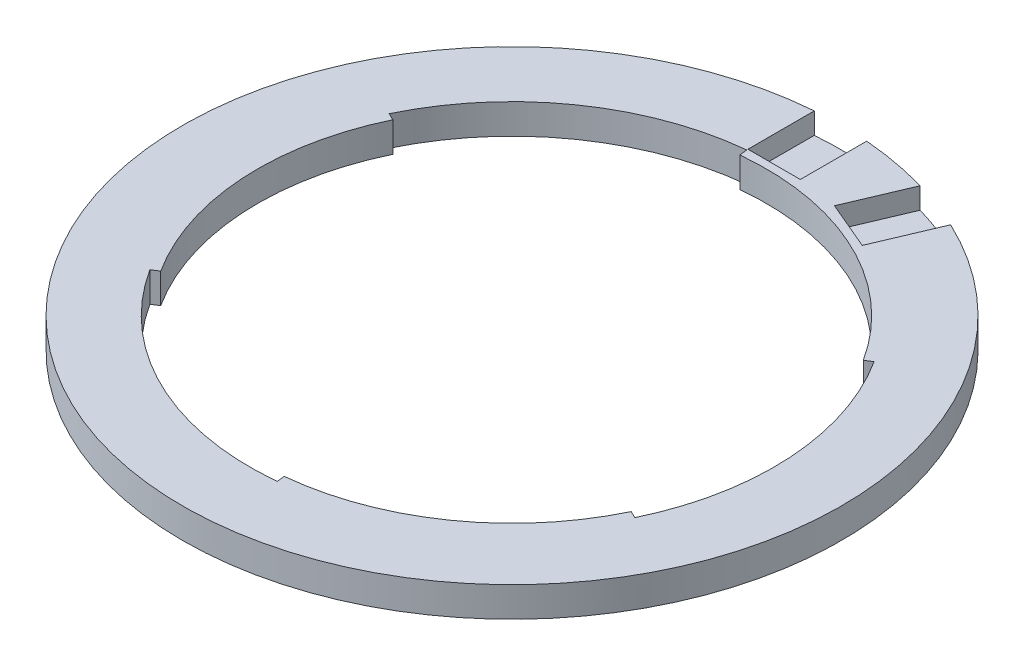
ISO-10303-21;
HEADER;
FILE_DESCRIPTION(('STEP AP214'),'2;1');
FILE_NAME('part.step','',(''),(''),'','','');
FILE_SCHEMA(('AUTOMOTIVE_DESIGN { 1 0 10303 214 1 1 1 1 }'));
ENDSEC;
DATA;
#1=APPLICATION_CONTEXT('core data for automotive mechanical design processes');
#2=APPLICATION_PROTOCOL_DEFINITION('international standard','automotive_design',2000,#1);
#3=PRODUCT_CONTEXT('',#1,'mechanical');
#4=PRODUCT('Part','Part','',(#3));
#5=PRODUCT_RELATED_PRODUCT_CATEGORY('part','',(#4));
#6=PRODUCT_DEFINITION_FORMATION('','',#4);
#7=PRODUCT_DEFINITION_CONTEXT('part definition',#1,'design');
#8=PRODUCT_DEFINITION('design','',#6,#7);
#9=PRODUCT_DEFINITION_SHAPE('','',#8);
#10=(LENGTH_UNIT() NAMED_UNIT(*) SI_UNIT(.MILLI.,.METRE.));
#11=(NAMED_UNIT(*) PLANE_ANGLE_UNIT() SI_UNIT($,.RADIAN.));
#12=(NAMED_UNIT(*) SI_UNIT($,.STERADIAN.) SOLID_ANGLE_UNIT());
#13=UNCERTAINTY_MEASURE_WITH_UNIT(LENGTH_MEASURE(1.E-05),#10,'distance_accuracy_value','');
#14=(GEOMETRIC_REPRESENTATION_CONTEXT(3) GLOBAL_UNCERTAINTY_ASSIGNED_CONTEXT((#13)) GLOBAL_UNIT_ASSIGNED_CONTEXT((#10,
#11,#12)) REPRESENTATION_CONTEXT('',''));
#15=CARTESIAN_POINT('',(0.,0.,0.));
#16=DIRECTION('',(0.,0.,1.));
#17=DIRECTION('',(1.,0.,0.));
#18=AXIS2_PLACEMENT_3D('',#15,#16,#17);
#19=CARTESIAN_POINT('',(0.,2.4,0.));
#20=DIRECTION('',(0.,1.,0.));
#21=DIRECTION('',(0.,0.,1.));
#22=AXIS2_PLACEMENT_3D('',#19,#20,#21);
#23=PLANE('',#22);
#24=CARTESIAN_POINT('',(0.,2.4,0.));
#25=DIRECTION('',(0.,1.,0.));
#26=DIRECTION('',(0.,0.,1.));
#27=AXIS2_PLACEMENT_3D('',#24,#25,#26);
#28=CIRCLE('',#27,20.376145218496);
#29=CARTESIAN_POINT('',(2.02750222855229,2.4,20.2750222855229));
#30=VERTEX_POINT('',#29);
#31=CARTESIAN_POINT('',(18.3683117845196,2.4,8.82000091564142));
#32=VERTEX_POINT('',#31);
#33=EDGE_CURVE('E223',#30,#32,#28,.T.);
#34=ORIENTED_EDGE('',*,*,#33,.F.);
#35=DIRECTION('',(0.0995037190209989,0.,0.995037190209989));
#36=VECTOR('',#35,1.);
#37=CARTESIAN_POINT('',(0.,2.4,0.));
#38=LINE('',#37,#36);
#39=CARTESIAN_POINT('',(2.09011250968342,2.4,20.9011250968342));
#40=VERTEX_POINT('',#39);
#41=EDGE_CURVE('E235',#30,#40,#38,.T.);
#42=ORIENTED_EDGE('',*,*,#41,.T.);
#43=CARTESIAN_POINT('',(0.,2.4,0.));
#44=DIRECTION('',(0.,1.,0.));
#45=DIRECTION('',(0.,0.,1.));
#46=AXIS2_PLACEMENT_3D('',#43,#44,#45);
#47=CIRCLE('',#46,21.0053707564673);
#48=CARTESIAN_POINT('',(-17.6960082683758,2.4,11.317106166429));
#49=VERTEX_POINT('',#48);
#50=EDGE_CURVE('E247',#49,#40,#47,.T.);
#51=ORIENTED_EDGE('',*,*,#50,.F.);
#52=DIRECTION('',(0.842451603141898,0.,-0.538772026337343));
#53=VECTOR('',#52,1.);
#54=CARTESIAN_POINT('',(0.,2.4,0.));
#55=LINE('',#54,#53);
#56=CARTESIAN_POINT('',(-17.165916205174,2.4,10.978097048313));
#57=VERTEX_POINT('',#56);
#58=EDGE_CURVE('E252',#49,#57,#55,.T.);
#59=ORIENTED_EDGE('',*,*,#58,.T.);
#60=CARTESIAN_POINT('',(-18.3683117845196,2.4,-8.82000091564142));
#61=VERTEX_POINT('',#60);
#62=EDGE_CURVE('E241',#61,#57,#28,.T.);
#63=ORIENTED_EDGE('',*,*,#62,.F.);
#64=DIRECTION('',(0.901461566334253,0.,0.432859150789486));
#65=VECTOR('',#64,1.);
#66=CARTESIAN_POINT('',(0.,2.4,0.));
#67=LINE('',#66,#65);
#68=CARTESIAN_POINT('',(-18.9355344235567,2.4,-9.09236694766272));
#69=VERTEX_POINT('',#68);
#70=EDGE_CURVE('E263',#69,#61,#67,.T.);
#71=ORIENTED_EDGE('',*,*,#70,.F.);
#72=CARTESIAN_POINT('',(0.,2.4,0.));
#73=DIRECTION('',(0.,1.,0.));
#74=DIRECTION('',(0.,0.,1.));
#75=AXIS2_PLACEMENT_3D('',#72,#73,#74);
#76=CIRCLE('',#75,21.0053707564673);
#77=CARTESIAN_POINT('',(-2.09011250968342,2.4,-20.9011250968342));
#78=VERTEX_POINT('',#77);
#79=EDGE_CURVE('E272',#78,#69,#76,.T.);
#80=ORIENTED_EDGE('',*,*,#79,.F.);
#81=DIRECTION('',(-0.0995037190209989,0.,-0.995037190209989));
#82=VECTOR('',#81,1.);
#83=CARTESIAN_POINT('',(0.,2.4,0.));
#84=LINE('',#83,#82);
#85=CARTESIAN_POINT('',(-2.02750222855229,2.4,-20.2750222855229));
#86=VERTEX_POINT('',#85);
#87=EDGE_CURVE('E270',#86,#78,#84,.T.);
#88=ORIENTED_EDGE('',*,*,#87,.F.);
#89=CARTESIAN_POINT('',(17.165916205174,2.4,-10.978097048313));
#90=VERTEX_POINT('',#89);
#91=EDGE_CURVE('E239',#90,#86,#28,.T.);
#92=ORIENTED_EDGE('',*,*,#91,.F.);
#93=DIRECTION('',(0.842451603141898,0.,-0.538772026337343));
#94=VECTOR('',#93,1.);
#95=CARTESIAN_POINT('',(0.,2.4,0.));
#96=LINE('',#95,#94);
#97=CARTESIAN_POINT('',(17.6960082683758,2.4,-11.317106166429));
#98=VERTEX_POINT('',#97);
#99=EDGE_CURVE('E285',#90,#98,#96,.T.);
#100=ORIENTED_EDGE('',*,*,#99,.T.);
#101=CARTESIAN_POINT('',(0.,2.4,0.));
#102=DIRECTION('',(0.,1.,0.));
#103=DIRECTION('',(0.,0.,1.));
#104=AXIS2_PLACEMENT_3D('',#101,#102,#103);
#105=CIRCLE('',#104,21.0053707564673);
#106=CARTESIAN_POINT('',(18.9355344235567,2.4,9.09236694766273));
#107=VERTEX_POINT('',#106);
#108=EDGE_CURVE('E292',#107,#98,#105,.T.);
#109=ORIENTED_EDGE('',*,*,#108,.F.);
#110=DIRECTION('',(0.901461566334253,0.,0.432859150789486));
#111=VECTOR('',#110,1.);
#112=CARTESIAN_POINT('',(0.,2.4,0.));
#113=LINE('',#112,#111);
#114=EDGE_CURVE('E238',#32,#107,#113,.T.);
#115=ORIENTED_EDGE('',*,*,#114,.F.);
#116=EDGE_LOOP('',(#34,#42,#51,#59,#63,#71,#80,#88,#92,#100,#109,#115));
#117=FACE_BOUND('',#116,.T.);
#118=DIRECTION('',(-0.390400317849414,0.,0.920645204094974));
#119=VECTOR('',#118,1.);
#120=CARTESIAN_POINT('',(-2.90003239289916,2.4,-1.22976100122565));
#121=LINE('',#120,#119);
#122=CARTESIAN_POINT('',(7.33290657314833,2.4,-25.3611608801624));
#123=VERTEX_POINT('',#122);
#124=CARTESIAN_POINT('',(5.29021923078603,2.4,-20.5440789792794));
#125=VERTEX_POINT('',#124);
#126=EDGE_CURVE('E327',#123,#125,#121,.T.);
#127=ORIENTED_EDGE('',*,*,#126,.F.);
#128=CARTESIAN_POINT('',(0.,2.4,0.));
#129=DIRECTION('',(0.,1.,0.));
#130=DIRECTION('',(0.,0.,1.));
#131=AXIS2_PLACEMENT_3D('',#128,#129,#130);
#132=CIRCLE('',#131,26.4);
#133=CARTESIAN_POINT('',(2.1,2.4,-26.3163447309842));
#134=VERTEX_POINT('',#133);
#135=EDGE_CURVE('E306',#123,#134,#132,.T.);
#136=ORIENTED_EDGE('',*,*,#135,.T.);
#137=DIRECTION('',(0.,0.,1.));
#138=VECTOR('',#137,1.);
#139=CARTESIAN_POINT('',(2.10000000000002,2.4,0.));
#140=LINE('',#139,#138);
#141=CARTESIAN_POINT('',(2.1,2.4,-21.));
#142=VERTEX_POINT('',#141);
#143=EDGE_CURVE('E345',#134,#142,#140,.T.);
#144=ORIENTED_EDGE('',*,*,#143,.T.);
#145=DIRECTION('',(-1.,0.,0.));
#146=VECTOR('',#145,1.);
#147=CARTESIAN_POINT('',(0.,2.4,-21.));
#148=LINE('',#147,#146);
#149=CARTESIAN_POINT('',(-2.1,2.4,-21.));
#150=VERTEX_POINT('',#149);
#151=EDGE_CURVE('E343',#142,#150,#148,.T.);
#152=ORIENTED_EDGE('',*,*,#151,.T.);
#153=DIRECTION('',(0.,0.,-1.));
#154=VECTOR('',#153,1.);
#155=CARTESIAN_POINT('',(-2.10000000000002,2.4,0.));
#156=LINE('',#155,#154);
#157=CARTESIAN_POINT('',(-2.1,2.4,-26.3163447309842));
#158=VERTEX_POINT('',#157);
#159=EDGE_CURVE('E337',#150,#158,#156,.T.);
#160=ORIENTED_EDGE('',*,*,#159,.T.);
#161=CARTESIAN_POINT('',(11.2650908043718,2.4,-23.8758817464248));
#162=VERTEX_POINT('',#161);
#163=EDGE_CURVE('E334',#158,#162,#132,.T.);
#164=ORIENTED_EDGE('',*,*,#163,.T.);
#165=DIRECTION('',(0.390400317849414,0.,-0.920645204094974));
#166=VECTOR('',#165,1.);
#167=CARTESIAN_POINT('',(11.2650908043718,2.4,-23.8758817464248));
#168=LINE('',#167,#166);
#169=CARTESIAN_POINT('',(9.15692908798492,2.4,-18.9043976443119));
#170=VERTEX_POINT('',#169);
#171=EDGE_CURVE('E323',#170,#162,#168,.T.);
#172=ORIENTED_EDGE('',*,*,#171,.F.);
#173=DIRECTION('',(0.920645204094974,0.,0.390400317849414));
#174=VECTOR('',#173,1.);
#175=CARTESIAN_POINT('',(9.15692908798492,2.4,-18.9043976443119));
#176=LINE('',#175,#174);
#177=EDGE_CURVE('E320',#125,#170,#176,.T.);
#178=ORIENTED_EDGE('',*,*,#177,.F.);
#179=EDGE_LOOP('',(#127,#136,#144,#152,#160,#164,#172,#178));
#180=FACE_BOUND('',#179,.T.);
#181=ADVANCED_FACE('F82',(#117,#180),#23,.T.);
#182=CARTESIAN_POINT('',(0.,0.,0.));
#183=DIRECTION('',(0.,1.,0.));
#184=DIRECTION('',(0.,0.,1.));
#185=AXIS2_PLACEMENT_3D('',#182,#183,#184);
#186=PLANE('',#185);
#187=CARTESIAN_POINT('',(0.,0.,0.));
#188=DIRECTION('',(0.,1.,0.));
#189=DIRECTION('',(0.,0.,1.));
#190=AXIS2_PLACEMENT_3D('',#187,#188,#189);
#191=CIRCLE('',#190,26.4);
#192=CARTESIAN_POINT('',(0.,0.,26.4));
#193=VERTEX_POINT('',#192);
#194=EDGE_CURVE('E299',#193,#193,#191,.T.);
#195=ORIENTED_EDGE('',*,*,#194,.F.);
#196=EDGE_LOOP('',(#195));
#197=FACE_BOUND('',#196,.T.);
#198=DIRECTION('',(0.0995037190209989,0.,0.995037190209989));
#199=VECTOR('',#198,1.);
#200=CARTESIAN_POINT('',(0.,0.,0.));
#201=LINE('',#200,#199);
#202=CARTESIAN_POINT('',(2.02750222855229,0.,20.2750222855229));
#203=VERTEX_POINT('',#202);
#204=CARTESIAN_POINT('',(2.09011250968342,0.,20.9011250968342));
#205=VERTEX_POINT('',#204);
#206=EDGE_CURVE('E259',#203,#205,#201,.T.);
#207=ORIENTED_EDGE('',*,*,#206,.F.);
#208=CARTESIAN_POINT('',(0.,0.,0.));
#209=DIRECTION('',(0.,1.,0.));
#210=DIRECTION('',(0.,0.,1.));
#211=AXIS2_PLACEMENT_3D('',#208,#209,#210);
#212=CIRCLE('',#211,20.376145218496);
#213=CARTESIAN_POINT('',(18.3683117845196,0.,8.82000091564142));
#214=VERTEX_POINT('',#213);
#215=EDGE_CURVE('E98',#203,#214,#212,.T.);
#216=ORIENTED_EDGE('',*,*,#215,.T.);
#217=DIRECTION('',(0.901461566334253,0.,0.432859150789486));
#218=VECTOR('',#217,1.);
#219=CARTESIAN_POINT('',(0.,0.,0.));
#220=LINE('',#219,#218);
#221=CARTESIAN_POINT('',(18.9355344235567,0.,9.09236694766273));
#222=VERTEX_POINT('',#221);
#223=EDGE_CURVE('E282',#214,#222,#220,.T.);
#224=ORIENTED_EDGE('',*,*,#223,.T.);
#225=CARTESIAN_POINT('',(0.,0.,0.));
#226=DIRECTION('',(0.,1.,0.));
#227=DIRECTION('',(0.,0.,1.));
#228=AXIS2_PLACEMENT_3D('',#225,#226,#227);
#229=CIRCLE('',#228,21.0053707564673);
#230=CARTESIAN_POINT('',(17.6960082683758,0.,-11.317106166429));
#231=VERTEX_POINT('',#230);
#232=EDGE_CURVE('E284',#222,#231,#229,.T.);
#233=ORIENTED_EDGE('',*,*,#232,.T.);
#234=DIRECTION('',(0.842451603141898,0.,-0.538772026337343));
#235=VECTOR('',#234,1.);
#236=CARTESIAN_POINT('',(0.,0.,0.));
#237=LINE('',#236,#235);
#238=CARTESIAN_POINT('',(17.165916205174,0.,-10.978097048313));
#239=VERTEX_POINT('',#238);
#240=EDGE_CURVE('E288',#239,#231,#237,.T.);
#241=ORIENTED_EDGE('',*,*,#240,.F.);
#242=CARTESIAN_POINT('',(-2.02750222855229,0.,-20.2750222855229));
#243=VERTEX_POINT('',#242);
#244=EDGE_CURVE('E500',#239,#243,#212,.T.);
#245=ORIENTED_EDGE('',*,*,#244,.T.);
#246=DIRECTION('',(-0.0995037190209989,0.,-0.995037190209989));
#247=VECTOR('',#246,1.);
#248=CARTESIAN_POINT('',(0.,0.,0.));
#249=LINE('',#248,#247);
#250=CARTESIAN_POINT('',(-2.09011250968342,0.,-20.9011250968342));
#251=VERTEX_POINT('',#250);
#252=EDGE_CURVE('E260',#243,#251,#249,.T.);
#253=ORIENTED_EDGE('',*,*,#252,.T.);
#254=CARTESIAN_POINT('',(0.,0.,0.));
#255=DIRECTION('',(0.,1.,0.));
#256=DIRECTION('',(0.,0.,1.));
#257=AXIS2_PLACEMENT_3D('',#254,#255,#256);
#258=CIRCLE('',#257,21.0053707564673);
#259=CARTESIAN_POINT('',(-18.9355344235567,0.,-9.09236694766272));
#260=VERTEX_POINT('',#259);
#261=EDGE_CURVE('E262',#251,#260,#258,.T.);
#262=ORIENTED_EDGE('',*,*,#261,.T.);
#263=DIRECTION('',(0.901461566334253,0.,0.432859150789486));
#264=VECTOR('',#263,1.);
#265=CARTESIAN_POINT('',(0.,0.,0.));
#266=LINE('',#265,#264);
#267=CARTESIAN_POINT('',(-18.3683117845196,0.,-8.82000091564142));
#268=VERTEX_POINT('',#267);
#269=EDGE_CURVE('E266',#260,#268,#266,.T.);
#270=ORIENTED_EDGE('',*,*,#269,.T.);
#271=CARTESIAN_POINT('',(-17.165916205174,0.,10.978097048313));
#272=VERTEX_POINT('',#271);
#273=EDGE_CURVE('E106',#268,#272,#212,.T.);
#274=ORIENTED_EDGE('',*,*,#273,.T.);
#275=DIRECTION('',(0.842451603141898,0.,-0.538772026337343));
#276=VECTOR('',#275,1.);
#277=CARTESIAN_POINT('',(0.,0.,0.));
#278=LINE('',#277,#276);
#279=CARTESIAN_POINT('',(-17.6960082683758,0.,11.317106166429));
#280=VERTEX_POINT('',#279);
#281=EDGE_CURVE('E246',#280,#272,#278,.T.);
#282=ORIENTED_EDGE('',*,*,#281,.F.);
#283=CARTESIAN_POINT('',(0.,0.,0.));
#284=DIRECTION('',(0.,1.,0.));
#285=DIRECTION('',(0.,0.,1.));
#286=AXIS2_PLACEMENT_3D('',#283,#284,#285);
#287=CIRCLE('',#286,21.0053707564673);
#288=EDGE_CURVE('E250',#280,#205,#287,.T.);
#289=ORIENTED_EDGE('',*,*,#288,.T.);
#290=EDGE_LOOP('',(#207,#216,#224,#233,#241,#245,#253,#262,#270,#274,#282,#289));
#291=FACE_BOUND('',#290,.T.);
#292=ADVANCED_FACE('F398',(#197,#291),#186,.F.);
#293=CARTESIAN_POINT('',(0.,2.4,0.));
#294=DIRECTION('',(0.,-1.,0.));
#295=DIRECTION('',(0.,0.,-1.));
#296=AXIS2_PLACEMENT_3D('',#293,#294,#295);
#297=CYLINDRICAL_SURFACE('',#296,26.4);
#298=ORIENTED_EDGE('',*,*,#194,.T.);
#299=EDGE_LOOP('',(#298));
#300=FACE_BOUND('',#299,.T.);
#301=CARTESIAN_POINT('',(11.2650908043718,0.7,-23.8758817464248));
#302=DIRECTION('',(-0.920645204094974,0.,-0.390400317849414));
#303=VECTOR('',#302,1.);
#304=LINE('',#301,#303);
#305=CARTESIAN_POINT('',(11.2650908043718,0.7,-23.8758817464248));
#306=VERTEX_POINT('',#305);
#307=CARTESIAN_POINT('',(9.33173587577228,0.7,-24.6957224139085));
#308=VERTEX_POINT('',#307);
#309=EDGE_CURVE('E376',#306,#308,#304,.T.);
#310=ORIENTED_EDGE('',*,*,#309,.F.);
#311=DIRECTION('',(0.,1.,0.));
#312=VECTOR('',#311,1.);
#313=CARTESIAN_POINT('',(11.2650908043718,0.7,-23.8758817464248));
#314=LINE('',#313,#312);
#315=EDGE_CURVE('E317',#306,#162,#314,.T.);
#316=ORIENTED_EDGE('',*,*,#315,.T.);
#317=ORIENTED_EDGE('',*,*,#163,.F.);
#318=DIRECTION('',(0.,-1.,0.));
#319=VECTOR('',#318,1.);
#320=CARTESIAN_POINT('',(-2.1,2.4,-26.3163447309842));
#321=LINE('',#320,#319);
#322=CARTESIAN_POINT('',(-2.1,0.7,-26.3163447309842));
#323=VERTEX_POINT('',#322);
#324=EDGE_CURVE('E360',#323,#158,#321,.F.);
#325=ORIENTED_EDGE('',*,*,#324,.F.);
#326=CARTESIAN_POINT('',(0.,0.7,0.));
#327=DIRECTION('',(0.,1.,0.));
#328=DIRECTION('',(0.,0.,1.));
#329=AXIS2_PLACEMENT_3D('',#326,#327,#328);
#330=CIRCLE('',#329,26.4);
#331=CARTESIAN_POINT('',(2.1,0.7,-26.3163447309842));
#332=VERTEX_POINT('',#331);
#333=EDGE_CURVE('E336',#332,#323,#330,.T.);
#334=ORIENTED_EDGE('',*,*,#333,.F.);
#335=DIRECTION('',(0.,-1.,0.));
#336=VECTOR('',#335,1.);
#337=CARTESIAN_POINT('',(2.1,2.4,-26.3163447309842));
#338=LINE('',#337,#336);
#339=EDGE_CURVE('E341',#134,#332,#338,.T.);
#340=ORIENTED_EDGE('',*,*,#339,.F.);
#341=ORIENTED_EDGE('',*,*,#135,.F.);
#342=DIRECTION('',(0.,-1.,0.));
#343=VECTOR('',#342,1.);
#344=CARTESIAN_POINT('',(7.33290657314833,2.4,-25.3611608801624));
#345=LINE('',#344,#343);
#346=CARTESIAN_POINT('',(7.33290657314833,0.7,-25.3611608801624));
#347=VERTEX_POINT('',#346);
#348=EDGE_CURVE('E307',#123,#347,#345,.T.);
#349=ORIENTED_EDGE('',*,*,#348,.T.);
#350=CARTESIAN_POINT('',(0.,0.7,0.));
#351=DIRECTION('',(0.,-1.,0.));
#352=DIRECTION('',(0.,0.,-1.));
#353=AXIS2_PLACEMENT_3D('',#350,#351,#352);
#354=CIRCLE('',#353,26.4);
#355=EDGE_CURVE('E302',#347,#308,#354,.T.);
#356=ORIENTED_EDGE('',*,*,#355,.T.);
#357=EDGE_LOOP('',(#310,#316,#317,#325,#334,#340,#341,#349,#356));
#358=FACE_BOUND('',#357,.T.);
#359=ADVANCED_FACE('F84',(#300,#358),#297,.T.);
#360=CARTESIAN_POINT('',(0.,0.7,0.));
#361=DIRECTION('',(0.,1.,0.));
#362=DIRECTION('',(0.,0.,1.));
#363=AXIS2_PLACEMENT_3D('',#360,#361,#362);
#364=PLANE('',#363);
#365=DIRECTION('',(0.,0.,1.));
#366=VECTOR('',#365,1.);
#367=CARTESIAN_POINT('',(2.10000000000002,0.7,0.));
#368=LINE('',#367,#366);
#369=CARTESIAN_POINT('',(2.1,0.7,-21.));
#370=VERTEX_POINT('',#369);
#371=EDGE_CURVE('E359',#332,#370,#368,.T.);
#372=ORIENTED_EDGE('',*,*,#371,.F.);
#373=ORIENTED_EDGE('',*,*,#333,.T.);
#374=DIRECTION('',(0.,0.,-1.));
#375=VECTOR('',#374,1.);
#376=CARTESIAN_POINT('',(-2.10000000000002,0.7,0.));
#377=LINE('',#376,#375);
#378=CARTESIAN_POINT('',(-2.1,0.7,-21.));
#379=VERTEX_POINT('',#378);
#380=EDGE_CURVE('E362',#379,#323,#377,.T.);
#381=ORIENTED_EDGE('',*,*,#380,.F.);
#382=DIRECTION('',(-1.,0.,0.));
#383=VECTOR('',#382,1.);
#384=CARTESIAN_POINT('',(0.,0.7,-21.));
#385=LINE('',#384,#383);
#386=EDGE_CURVE('E366',#370,#379,#385,.T.);
#387=ORIENTED_EDGE('',*,*,#386,.F.);
#388=EDGE_LOOP('',(#372,#373,#381,#387));
#389=FACE_BOUND('',#388,.T.);
#390=ADVANCED_FACE('F407',(#389),#364,.T.);
#391=CARTESIAN_POINT('',(2.10000000000002,0.7,0.));
#392=DIRECTION('',(-1.,0.,0.));
#393=DIRECTION('',(0.,0.,1.));
#394=AXIS2_PLACEMENT_3D('',#391,#392,#393);
#395=PLANE('',#394);
#396=ORIENTED_EDGE('',*,*,#339,.T.);
#397=ORIENTED_EDGE('',*,*,#371,.T.);
#398=DIRECTION('',(0.,1.,0.));
#399=VECTOR('',#398,1.);
#400=CARTESIAN_POINT('',(2.1,0.7,-21.));
#401=LINE('',#400,#399);
#402=EDGE_CURVE('E363',#370,#142,#401,.T.);
#403=ORIENTED_EDGE('',*,*,#402,.T.);
#404=ORIENTED_EDGE('',*,*,#143,.F.);
#405=EDGE_LOOP('',(#396,#397,#403,#404));
#406=FACE_BOUND('',#405,.T.);
#407=ADVANCED_FACE('F418',(#406),#395,.T.);
#408=CARTESIAN_POINT('',(-2.10000000000002,0.7,0.));
#409=DIRECTION('',(1.,0.,0.));
#410=DIRECTION('',(0.,0.,-1.));
#411=AXIS2_PLACEMENT_3D('',#408,#409,#410);
#412=PLANE('',#411);
#413=ORIENTED_EDGE('',*,*,#324,.T.);
#414=ORIENTED_EDGE('',*,*,#159,.F.);
#415=DIRECTION('',(0.,1.,0.));
#416=VECTOR('',#415,1.);
#417=CARTESIAN_POINT('',(-2.1,0.7,-21.));
#418=LINE('',#417,#416);
#419=EDGE_CURVE('E333',#379,#150,#418,.T.);
#420=ORIENTED_EDGE('',*,*,#419,.F.);
#421=ORIENTED_EDGE('',*,*,#380,.T.);
#422=EDGE_LOOP('',(#413,#414,#420,#421));
#423=FACE_BOUND('',#422,.T.);
#424=ADVANCED_FACE('F415',(#423),#412,.T.);
#425=CARTESIAN_POINT('',(0.,0.7,-21.));
#426=DIRECTION('',(0.,0.,-1.));
#427=DIRECTION('',(-1.,0.,0.));
#428=AXIS2_PLACEMENT_3D('',#425,#426,#427);
#429=PLANE('',#428);
#430=ORIENTED_EDGE('',*,*,#151,.F.);
#431=ORIENTED_EDGE('',*,*,#402,.F.);
#432=ORIENTED_EDGE('',*,*,#386,.T.);
#433=ORIENTED_EDGE('',*,*,#419,.T.);
#434=EDGE_LOOP('',(#430,#431,#432,#433));
#435=FACE_BOUND('',#434,.T.);
#436=ADVANCED_FACE('F393',(#435),#429,.T.);
#437=CARTESIAN_POINT('',(0.,0.7,0.));
#438=DIRECTION('',(0.,-1.,0.));
#439=DIRECTION('',(0.,0.,-1.));
#440=AXIS2_PLACEMENT_3D('',#437,#438,#439);
#441=PLANE('',#440);
#442=DIRECTION('',(-0.390400317849414,0.,0.920645204094974));
#443=VECTOR('',#442,1.);
#444=CARTESIAN_POINT('',(5.29021923078603,0.7,-20.5440789792794));
#445=LINE('',#444,#443);
#446=CARTESIAN_POINT('',(5.29021923078603,0.7,-20.5440789792794));
#447=VERTEX_POINT('',#446);
#448=EDGE_CURVE('E332',#347,#447,#445,.T.);
#449=ORIENTED_EDGE('',*,*,#448,.T.);
#450=DIRECTION('',(0.920645204094974,0.,0.390400317849414));
#451=VECTOR('',#450,1.);
#452=CARTESIAN_POINT('',(9.15692908798492,0.7,-18.9043976443119));
#453=LINE('',#452,#451);
#454=CARTESIAN_POINT('',(9.15692908798492,0.7,-18.9043976443119));
#455=VERTEX_POINT('',#454);
#456=EDGE_CURVE('E328',#447,#455,#453,.T.);
#457=ORIENTED_EDGE('',*,*,#456,.T.);
#458=DIRECTION('',(0.390400317849414,0.,-0.920645204094974));
#459=VECTOR('',#458,1.);
#460=CARTESIAN_POINT('',(11.2650908043718,0.7,-23.8758817464248));
#461=LINE('',#460,#459);
#462=EDGE_CURVE('E331',#455,#306,#461,.T.);
#463=ORIENTED_EDGE('',*,*,#462,.T.);
#464=ORIENTED_EDGE('',*,*,#309,.T.);
#465=ORIENTED_EDGE('',*,*,#355,.F.);
#466=EDGE_LOOP('',(#449,#457,#463,#464,#465));
#467=FACE_BOUND('',#466,.T.);
#468=ADVANCED_FACE('F383',(#467),#441,.F.);
#469=CARTESIAN_POINT('',(5.29021923078603,0.7,-20.5440789792794));
#470=DIRECTION('',(-0.920645204094974,0.,-0.390400317849414));
#471=DIRECTION('',(-0.390400317849414,0.,0.920645204094974));
#472=AXIS2_PLACEMENT_3D('',#469,#470,#471);
#473=PLANE('',#472);
#474=ORIENTED_EDGE('',*,*,#126,.T.);
#475=DIRECTION('',(0.,1.,0.));
#476=VECTOR('',#475,1.);
#477=CARTESIAN_POINT('',(5.29021923078603,0.7,-20.5440789792794));
#478=LINE('',#477,#476);
#479=EDGE_CURVE('E91',#447,#125,#478,.T.);
#480=ORIENTED_EDGE('',*,*,#479,.F.);
#481=ORIENTED_EDGE('',*,*,#448,.F.);
#482=ORIENTED_EDGE('',*,*,#348,.F.);
#483=EDGE_LOOP('',(#474,#480,#481,#482));
#484=FACE_BOUND('',#483,.T.);
#485=ADVANCED_FACE('F392',(#484),#473,.F.);
#486=CARTESIAN_POINT('',(11.2650908043718,0.7,-23.8758817464248));
#487=DIRECTION('',(0.920645204094974,0.,0.390400317849414));
#488=DIRECTION('',(0.390400317849414,0.,-0.920645204094974));
#489=AXIS2_PLACEMENT_3D('',#486,#487,#488);
#490=PLANE('',#489);
#491=ORIENTED_EDGE('',*,*,#171,.T.);
#492=ORIENTED_EDGE('',*,*,#315,.F.);
#493=ORIENTED_EDGE('',*,*,#462,.F.);
#494=DIRECTION('',(0.,1.,0.));
#495=VECTOR('',#494,1.);
#496=CARTESIAN_POINT('',(9.15692908798492,0.7,-18.9043976443119));
#497=LINE('',#496,#495);
#498=EDGE_CURVE('E321',#455,#170,#497,.T.);
#499=ORIENTED_EDGE('',*,*,#498,.T.);
#500=EDGE_LOOP('',(#491,#492,#493,#499));
#501=FACE_BOUND('',#500,.T.);
#502=ADVANCED_FACE('F429',(#501),#490,.F.);
#503=CARTESIAN_POINT('',(9.15692908798492,0.7,-18.9043976443119));
#504=DIRECTION('',(-0.390400317849414,0.,0.920645204094974));
#505=DIRECTION('',(0.920645204094974,0.,0.390400317849414));
#506=AXIS2_PLACEMENT_3D('',#503,#504,#505);
#507=PLANE('',#506);
#508=ORIENTED_EDGE('',*,*,#177,.T.);
#509=ORIENTED_EDGE('',*,*,#498,.F.);
#510=ORIENTED_EDGE('',*,*,#456,.F.);
#511=ORIENTED_EDGE('',*,*,#479,.T.);
#512=EDGE_LOOP('',(#508,#509,#510,#511));
#513=FACE_BOUND('',#512,.T.);
#514=ADVANCED_FACE('F395',(#513),#507,.F.);
#515=CARTESIAN_POINT('',(0.,0.,0.));
#516=DIRECTION('',(0.538772026337343,0.,0.842451603141898));
#517=DIRECTION('',(0.842451603141898,0.,-0.538772026337343));
#518=AXIS2_PLACEMENT_3D('',#515,#516,#517);
#519=PLANE('',#518);
#520=DIRECTION('',(0.,1.,0.));
#521=VECTOR('',#520,1.);
#522=CARTESIAN_POINT('',(17.165916205174,0.,-10.978097048313));
#523=LINE('',#522,#521);
#524=EDGE_CURVE('E273',#239,#90,#523,.T.);
#525=ORIENTED_EDGE('',*,*,#524,.F.);
#526=ORIENTED_EDGE('',*,*,#240,.T.);
#527=DIRECTION('',(0.,1.,0.));
#528=VECTOR('',#527,1.);
#529=CARTESIAN_POINT('',(17.6960082683758,0.,-11.317106166429));
#530=LINE('',#529,#528);
#531=EDGE_CURVE('E296',#231,#98,#530,.T.);
#532=ORIENTED_EDGE('',*,*,#531,.T.);
#533=ORIENTED_EDGE('',*,*,#99,.F.);
#534=EDGE_LOOP('',(#525,#526,#532,#533));
#535=FACE_BOUND('',#534,.T.);
#536=ADVANCED_FACE('F453',(#535),#519,.T.);
#537=CARTESIAN_POINT('',(0.,0.,0.));
#538=DIRECTION('',(0.,1.,0.));
#539=DIRECTION('',(0.,0.,1.));
#540=AXIS2_PLACEMENT_3D('',#537,#538,#539);
#541=CYLINDRICAL_SURFACE('',#540,21.0053707564673);
#542=ORIENTED_EDGE('',*,*,#108,.T.);
#543=ORIENTED_EDGE('',*,*,#531,.F.);
#544=ORIENTED_EDGE('',*,*,#232,.F.);
#545=DIRECTION('',(0.,1.,0.));
#546=VECTOR('',#545,1.);
#547=CARTESIAN_POINT('',(18.9355344235567,0.,9.09236694766273));
#548=LINE('',#547,#546);
#549=EDGE_CURVE('E290',#222,#107,#548,.T.);
#550=ORIENTED_EDGE('',*,*,#549,.T.);
#551=EDGE_LOOP('',(#542,#543,#544,#550));
#552=FACE_BOUND('',#551,.T.);
#553=ADVANCED_FACE('F457',(#552),#541,.F.);
#554=CARTESIAN_POINT('',(0.,0.,0.));
#555=DIRECTION('',(-0.432859150789486,0.,0.901461566334253));
#556=DIRECTION('',(0.901461566334253,0.,0.432859150789486));
#557=AXIS2_PLACEMENT_3D('',#554,#555,#556);
#558=PLANE('',#557);
#559=ORIENTED_EDGE('',*,*,#223,.F.);
#560=DIRECTION('',(0.,1.,0.));
#561=VECTOR('',#560,1.);
#562=CARTESIAN_POINT('',(18.3683117845196,0.,8.82000091564142));
#563=LINE('',#562,#561);
#564=EDGE_CURVE('E228',#214,#32,#563,.T.);
#565=ORIENTED_EDGE('',*,*,#564,.T.);
#566=ORIENTED_EDGE('',*,*,#114,.T.);
#567=ORIENTED_EDGE('',*,*,#549,.F.);
#568=EDGE_LOOP('',(#559,#565,#566,#567));
#569=FACE_BOUND('',#568,.T.);
#570=ADVANCED_FACE('F413',(#569),#558,.F.);
#571=CARTESIAN_POINT('',(0.,0.,0.));
#572=DIRECTION('',(-0.995037190209989,0.,0.0995037190209989));
#573=DIRECTION('',(0.0995037190209989,0.,0.995037190209989));
#574=AXIS2_PLACEMENT_3D('',#571,#572,#573);
#575=PLANE('',#574);
#576=DIRECTION('',(0.,1.,0.));
#577=VECTOR('',#576,1.);
#578=CARTESIAN_POINT('',(2.02750222855229,0.,20.2750222855229));
#579=LINE('',#578,#577);
#580=EDGE_CURVE('E220',#203,#30,#579,.T.);
#581=ORIENTED_EDGE('',*,*,#580,.F.);
#582=ORIENTED_EDGE('',*,*,#206,.T.);
#583=DIRECTION('',(0.,1.,0.));
#584=VECTOR('',#583,1.);
#585=CARTESIAN_POINT('',(2.09011250968342,0.,20.9011250968342));
#586=LINE('',#585,#584);
#587=EDGE_CURVE('E244',#205,#40,#586,.T.);
#588=ORIENTED_EDGE('',*,*,#587,.T.);
#589=ORIENTED_EDGE('',*,*,#41,.F.);
#590=EDGE_LOOP('',(#581,#582,#588,#589));
#591=FACE_BOUND('',#590,.T.);
#592=ADVANCED_FACE('F242',(#591),#575,.T.);
#593=CARTESIAN_POINT('',(0.,0.,0.));
#594=DIRECTION('',(0.,1.,0.));
#595=DIRECTION('',(0.,0.,1.));
#596=AXIS2_PLACEMENT_3D('',#593,#594,#595);
#597=CYLINDRICAL_SURFACE('',#596,21.0053707564673);
#598=ORIENTED_EDGE('',*,*,#50,.T.);
#599=ORIENTED_EDGE('',*,*,#587,.F.);
#600=ORIENTED_EDGE('',*,*,#288,.F.);
#601=DIRECTION('',(0.,1.,0.));
#602=VECTOR('',#601,1.);
#603=CARTESIAN_POINT('',(-17.6960082683758,0.,11.317106166429));
#604=LINE('',#603,#602);
#605=EDGE_CURVE('E257',#280,#49,#604,.T.);
#606=ORIENTED_EDGE('',*,*,#605,.T.);
#607=EDGE_LOOP('',(#598,#599,#600,#606));
#608=FACE_BOUND('',#607,.T.);
#609=ADVANCED_FACE('F482',(#608),#597,.F.);
#610=CARTESIAN_POINT('',(0.,0.,0.));
#611=DIRECTION('',(0.538772026337343,0.,0.842451603141898));
#612=DIRECTION('',(0.842451603141898,0.,-0.538772026337343));
#613=AXIS2_PLACEMENT_3D('',#610,#611,#612);
#614=PLANE('',#613);
#615=DIRECTION('',(0.,1.,0.));
#616=VECTOR('',#615,1.);
#617=CARTESIAN_POINT('',(-17.165916205174,0.,10.978097048313));
#618=LINE('',#617,#616);
#619=EDGE_CURVE('E229',#57,#272,#618,.F.);
#620=ORIENTED_EDGE('',*,*,#619,.F.);
#621=ORIENTED_EDGE('',*,*,#58,.F.);
#622=ORIENTED_EDGE('',*,*,#605,.F.);
#623=ORIENTED_EDGE('',*,*,#281,.T.);
#624=EDGE_LOOP('',(#620,#621,#622,#623));
#625=FACE_BOUND('',#624,.T.);
#626=ADVANCED_FACE('F478',(#625),#614,.T.);
#627=CARTESIAN_POINT('',(0.,0.,0.));
#628=DIRECTION('',(-0.432859150789486,0.,0.901461566334253));
#629=DIRECTION('',(0.901461566334253,0.,0.432859150789486));
#630=AXIS2_PLACEMENT_3D('',#627,#628,#629);
#631=PLANE('',#630);
#632=ORIENTED_EDGE('',*,*,#70,.T.);
#633=DIRECTION('',(0.,1.,0.));
#634=VECTOR('',#633,1.);
#635=CARTESIAN_POINT('',(-18.3683117845196,0.,-8.82000091564142));
#636=LINE('',#635,#634);
#637=EDGE_CURVE('E523',#61,#268,#636,.F.);
#638=ORIENTED_EDGE('',*,*,#637,.T.);
#639=ORIENTED_EDGE('',*,*,#269,.F.);
#640=DIRECTION('',(0.,1.,0.));
#641=VECTOR('',#640,1.);
#642=CARTESIAN_POINT('',(-18.9355344235567,0.,-9.09236694766272));
#643=LINE('',#642,#641);
#644=EDGE_CURVE('E278',#260,#69,#643,.T.);
#645=ORIENTED_EDGE('',*,*,#644,.T.);
#646=EDGE_LOOP('',(#632,#638,#639,#645));
#647=FACE_BOUND('',#646,.T.);
#648=ADVANCED_FACE('F474',(#647),#631,.F.);
#649=CARTESIAN_POINT('',(0.,0.,0.));
#650=DIRECTION('',(0.,1.,0.));
#651=DIRECTION('',(0.,0.,1.));
#652=AXIS2_PLACEMENT_3D('',#649,#650,#651);
#653=CYLINDRICAL_SURFACE('',#652,21.0053707564673);
#654=ORIENTED_EDGE('',*,*,#79,.T.);
#655=ORIENTED_EDGE('',*,*,#644,.F.);
#656=ORIENTED_EDGE('',*,*,#261,.F.);
#657=DIRECTION('',(0.,1.,0.));
#658=VECTOR('',#657,1.);
#659=CARTESIAN_POINT('',(-2.09011250968342,0.,-20.9011250968342));
#660=LINE('',#659,#658);
#661=EDGE_CURVE('E269',#251,#78,#660,.T.);
#662=ORIENTED_EDGE('',*,*,#661,.T.);
#663=EDGE_LOOP('',(#654,#655,#656,#662));
#664=FACE_BOUND('',#663,.T.);
#665=ADVANCED_FACE('F470',(#664),#653,.F.);
#666=CARTESIAN_POINT('',(0.,0.,0.));
#667=DIRECTION('',(0.995037190209989,0.,-0.0995037190209989));
#668=DIRECTION('',(-0.0995037190209989,0.,-0.995037190209989));
#669=AXIS2_PLACEMENT_3D('',#666,#667,#668);
#670=PLANE('',#669);
#671=ORIENTED_EDGE('',*,*,#252,.F.);
#672=DIRECTION('',(0.,1.,0.));
#673=VECTOR('',#672,1.);
#674=CARTESIAN_POINT('',(-2.02750222855229,0.,-20.2750222855229));
#675=LINE('',#674,#673);
#676=EDGE_CURVE('E12',#243,#86,#675,.T.);
#677=ORIENTED_EDGE('',*,*,#676,.T.);
#678=ORIENTED_EDGE('',*,*,#87,.T.);
#679=ORIENTED_EDGE('',*,*,#661,.F.);
#680=EDGE_LOOP('',(#671,#677,#678,#679));
#681=FACE_BOUND('',#680,.T.);
#682=ADVANCED_FACE('F466',(#681),#670,.F.);
#683=CARTESIAN_POINT('',(0.,0.,0.));
#684=DIRECTION('',(0.,1.,0.));
#685=DIRECTION('',(0.,0.,1.));
#686=AXIS2_PLACEMENT_3D('',#683,#684,#685);
#687=CYLINDRICAL_SURFACE('',#686,20.376145218496);
#688=ORIENTED_EDGE('',*,*,#524,.T.);
#689=ORIENTED_EDGE('',*,*,#91,.T.);
#690=ORIENTED_EDGE('',*,*,#676,.F.);
#691=ORIENTED_EDGE('',*,*,#244,.F.);
#692=EDGE_LOOP('',(#688,#689,#690,#691));
#693=FACE_BOUND('',#692,.T.);
#694=ADVANCED_FACE('F469',(#693),#687,.F.);
#695=ORIENTED_EDGE('',*,*,#619,.T.);
#696=ORIENTED_EDGE('',*,*,#273,.F.);
#697=ORIENTED_EDGE('',*,*,#637,.F.);
#698=ORIENTED_EDGE('',*,*,#62,.T.);
#699=EDGE_LOOP('',(#695,#696,#697,#698));
#700=FACE_BOUND('',#699,.T.);
#701=ADVANCED_FACE('F490',(#700),#687,.F.);
#702=ORIENTED_EDGE('',*,*,#215,.F.);
#703=ORIENTED_EDGE('',*,*,#580,.T.);
#704=ORIENTED_EDGE('',*,*,#33,.T.);
#705=ORIENTED_EDGE('',*,*,#564,.F.);
#706=EDGE_LOOP('',(#702,#703,#704,#705));
#707=FACE_BOUND('',#706,.T.);
#708=ADVANCED_FACE('F222',(#707),#687,.F.);
#709=CLOSED_SHELL('',(#181,#292,#359,#390,#407,#424,#436,#468,#485,#502,#514,#536,#553,#570,
#592,#609,#626,#648,#665,#682,#694,#701,#708));
#710=MANIFOLD_SOLID_BREP('B2',#709);
#711=ADVANCED_BREP_SHAPE_REPRESENTATION('',(#18,#710),#14);
#712=SHAPE_DEFINITION_REPRESENTATION(#9,#711);
ENDSEC;
END-ISO-10303-21;
